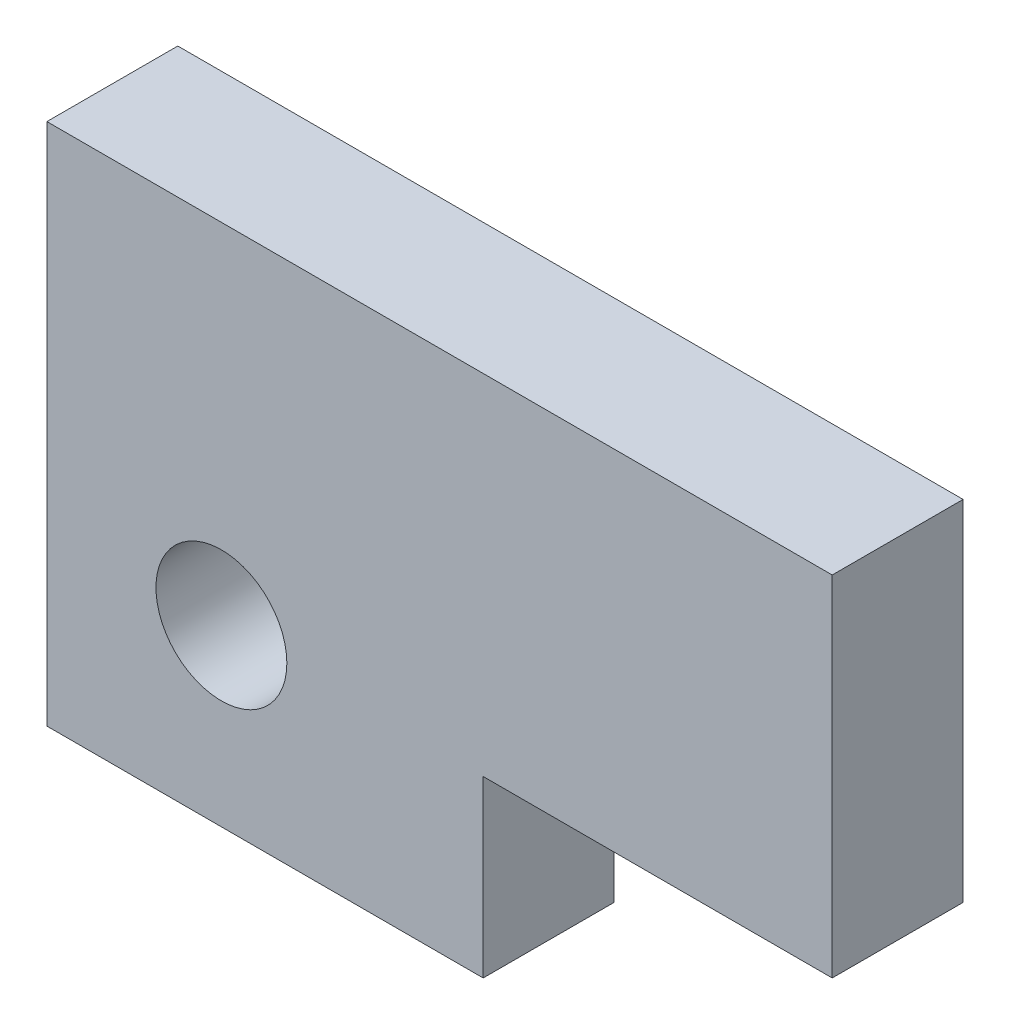
ISO-10303-21;
HEADER;
FILE_DESCRIPTION(('STEP AP214'),'2;1');
FILE_NAME('part.step','',(''),(''),'','','');
FILE_SCHEMA(('AUTOMOTIVE_DESIGN { 1 0 10303 214 1 1 1 1 }'));
ENDSEC;
DATA;
#1=APPLICATION_CONTEXT('core data for automotive mechanical design processes');
#2=APPLICATION_PROTOCOL_DEFINITION('international standard','automotive_design',2000,#1);
#3=PRODUCT_CONTEXT('',#1,'mechanical');
#4=PRODUCT('Part','Part','',(#3));
#5=PRODUCT_RELATED_PRODUCT_CATEGORY('part','',(#4));
#6=PRODUCT_DEFINITION_FORMATION('','',#4);
#7=PRODUCT_DEFINITION_CONTEXT('part definition',#1,'design');
#8=PRODUCT_DEFINITION('design','',#6,#7);
#9=PRODUCT_DEFINITION_SHAPE('','',#8);
#10=(LENGTH_UNIT() NAMED_UNIT(*) SI_UNIT(.MILLI.,.METRE.));
#11=(NAMED_UNIT(*) PLANE_ANGLE_UNIT() SI_UNIT($,.RADIAN.));
#12=(NAMED_UNIT(*) SI_UNIT($,.STERADIAN.) SOLID_ANGLE_UNIT());
#13=UNCERTAINTY_MEASURE_WITH_UNIT(LENGTH_MEASURE(1.E-05),#10,'distance_accuracy_value','');
#14=(GEOMETRIC_REPRESENTATION_CONTEXT(3) GLOBAL_UNCERTAINTY_ASSIGNED_CONTEXT((#13)) GLOBAL_UNIT_ASSIGNED_CONTEXT((#10,
#11,#12)) REPRESENTATION_CONTEXT('',''));
#15=CARTESIAN_POINT('',(0.,0.,0.));
#16=DIRECTION('',(0.,0.,1.));
#17=DIRECTION('',(1.,0.,0.));
#18=AXIS2_PLACEMENT_3D('',#15,#16,#17);
#19=CARTESIAN_POINT('',(0.,0.,3.));
#20=DIRECTION('',(1.,0.,0.));
#21=DIRECTION('',(0.,1.,0.));
#22=AXIS2_PLACEMENT_3D('',#19,#20,#21);
#23=PLANE('',#22);
#24=DIRECTION('',(0.,-1.,0.));
#25=VECTOR('',#24,1.);
#26=CARTESIAN_POINT('',(0.,0.,0.));
#27=LINE('',#26,#25);
#28=CARTESIAN_POINT('',(0.,12.,0.));
#29=VERTEX_POINT('',#28);
#30=CARTESIAN_POINT('',(0.,0.,0.));
#31=VERTEX_POINT('',#30);
#32=EDGE_CURVE('E119',#29,#31,#27,.T.);
#33=ORIENTED_EDGE('',*,*,#32,.T.);
#34=DIRECTION('',(0.,0.,-1.));
#35=VECTOR('',#34,1.);
#36=CARTESIAN_POINT('',(0.,0.,3.));
#37=LINE('',#36,#35);
#38=CARTESIAN_POINT('',(0.,0.,3.));
#39=VERTEX_POINT('',#38);
#40=EDGE_CURVE('E11',#39,#31,#37,.T.);
#41=ORIENTED_EDGE('',*,*,#40,.F.);
#42=DIRECTION('',(0.,-1.,0.));
#43=VECTOR('',#42,1.);
#44=CARTESIAN_POINT('',(0.,0.,3.));
#45=LINE('',#44,#43);
#46=CARTESIAN_POINT('',(0.,12.,3.));
#47=VERTEX_POINT('',#46);
#48=EDGE_CURVE('E130',#47,#39,#45,.T.);
#49=ORIENTED_EDGE('',*,*,#48,.F.);
#50=DIRECTION('',(0.,0.,-1.));
#51=VECTOR('',#50,1.);
#52=CARTESIAN_POINT('',(0.,12.,3.));
#53=LINE('',#52,#51);
#54=EDGE_CURVE('E115',#47,#29,#53,.T.);
#55=ORIENTED_EDGE('',*,*,#54,.T.);
#56=EDGE_LOOP('',(#33,#41,#49,#55));
#57=FACE_BOUND('',#56,.T.);
#58=ADVANCED_FACE('F35',(#57),#23,.F.);
#59=CARTESIAN_POINT('',(0.,0.,3.));
#60=DIRECTION('',(0.,1.,0.));
#61=DIRECTION('',(0.,0.,1.));
#62=AXIS2_PLACEMENT_3D('',#59,#60,#61);
#63=PLANE('',#62);
#64=DIRECTION('',(1.,0.,0.));
#65=VECTOR('',#64,1.);
#66=CARTESIAN_POINT('',(0.,0.,0.));
#67=LINE('',#66,#65);
#68=CARTESIAN_POINT('',(9.99999999999999,0.,0.));
#69=VERTEX_POINT('',#68);
#70=EDGE_CURVE('E122',#31,#69,#67,.T.);
#71=ORIENTED_EDGE('',*,*,#70,.T.);
#72=DIRECTION('',(0.,0.,-1.));
#73=VECTOR('',#72,1.);
#74=CARTESIAN_POINT('',(9.99999999999999,0.,3.));
#75=LINE('',#74,#73);
#76=CARTESIAN_POINT('',(9.99999999999999,0.,3.));
#77=VERTEX_POINT('',#76);
#78=EDGE_CURVE('E43',#77,#69,#75,.T.);
#79=ORIENTED_EDGE('',*,*,#78,.F.);
#80=DIRECTION('',(1.,0.,0.));
#81=VECTOR('',#80,1.);
#82=CARTESIAN_POINT('',(0.,0.,3.));
#83=LINE('',#82,#81);
#84=EDGE_CURVE('E88',#39,#77,#83,.T.);
#85=ORIENTED_EDGE('',*,*,#84,.F.);
#86=ORIENTED_EDGE('',*,*,#40,.T.);
#87=EDGE_LOOP('',(#71,#79,#85,#86));
#88=FACE_BOUND('',#87,.T.);
#89=ADVANCED_FACE('F155',(#88),#63,.F.);
#90=CARTESIAN_POINT('',(9.99999999999999,4.,3.));
#91=DIRECTION('',(-1.,0.,0.));
#92=DIRECTION('',(0.,0.,1.));
#93=AXIS2_PLACEMENT_3D('',#90,#91,#92);
#94=PLANE('',#93);
#95=DIRECTION('',(0.,1.,0.));
#96=VECTOR('',#95,1.);
#97=CARTESIAN_POINT('',(9.99999999999999,4.,0.));
#98=LINE('',#97,#96);
#99=CARTESIAN_POINT('',(9.99999999999999,4.,0.));
#100=VERTEX_POINT('',#99);
#101=EDGE_CURVE('E125',#69,#100,#98,.T.);
#102=ORIENTED_EDGE('',*,*,#101,.T.);
#103=DIRECTION('',(0.,0.,-1.));
#104=VECTOR('',#103,1.);
#105=CARTESIAN_POINT('',(9.99999999999999,4.,3.));
#106=LINE('',#105,#104);
#107=CARTESIAN_POINT('',(9.99999999999999,4.,3.));
#108=VERTEX_POINT('',#107);
#109=EDGE_CURVE('E110',#108,#100,#106,.T.);
#110=ORIENTED_EDGE('',*,*,#109,.F.);
#111=DIRECTION('',(0.,1.,0.));
#112=VECTOR('',#111,1.);
#113=CARTESIAN_POINT('',(9.99999999999999,4.,3.));
#114=LINE('',#113,#112);
#115=EDGE_CURVE('E101',#77,#108,#114,.T.);
#116=ORIENTED_EDGE('',*,*,#115,.F.);
#117=ORIENTED_EDGE('',*,*,#78,.T.);
#118=EDGE_LOOP('',(#102,#110,#116,#117));
#119=FACE_BOUND('',#118,.T.);
#120=ADVANCED_FACE('F136',(#119),#94,.F.);
#121=CARTESIAN_POINT('',(18.,4.,3.));
#122=DIRECTION('',(0.,1.,0.));
#123=DIRECTION('',(-1.,0.,0.));
#124=AXIS2_PLACEMENT_3D('',#121,#122,#123);
#125=PLANE('',#124);
#126=DIRECTION('',(1.,0.,0.));
#127=VECTOR('',#126,1.);
#128=CARTESIAN_POINT('',(18.,4.,0.));
#129=LINE('',#128,#127);
#130=CARTESIAN_POINT('',(18.,4.,0.));
#131=VERTEX_POINT('',#130);
#132=EDGE_CURVE('E109',#100,#131,#129,.T.);
#133=ORIENTED_EDGE('',*,*,#132,.T.);
#134=DIRECTION('',(0.,0.,-1.));
#135=VECTOR('',#134,1.);
#136=CARTESIAN_POINT('',(18.,4.,3.));
#137=LINE('',#136,#135);
#138=CARTESIAN_POINT('',(18.,4.,3.));
#139=VERTEX_POINT('',#138);
#140=EDGE_CURVE('E106',#139,#131,#137,.T.);
#141=ORIENTED_EDGE('',*,*,#140,.F.);
#142=DIRECTION('',(1.,0.,0.));
#143=VECTOR('',#142,1.);
#144=CARTESIAN_POINT('',(18.,4.,3.));
#145=LINE('',#144,#143);
#146=EDGE_CURVE('E95',#108,#139,#145,.T.);
#147=ORIENTED_EDGE('',*,*,#146,.F.);
#148=ORIENTED_EDGE('',*,*,#109,.T.);
#149=EDGE_LOOP('',(#133,#141,#147,#148));
#150=FACE_BOUND('',#149,.T.);
#151=ADVANCED_FACE('F107',(#150),#125,.F.);
#152=CARTESIAN_POINT('',(18.,4.,3.));
#153=DIRECTION('',(-1.,0.,0.));
#154=DIRECTION('',(0.,0.,1.));
#155=AXIS2_PLACEMENT_3D('',#152,#153,#154);
#156=PLANE('',#155);
#157=DIRECTION('',(0.,1.,0.));
#158=VECTOR('',#157,1.);
#159=CARTESIAN_POINT('',(18.,4.,0.));
#160=LINE('',#159,#158);
#161=CARTESIAN_POINT('',(18.,12.,0.));
#162=VERTEX_POINT('',#161);
#163=EDGE_CURVE('E74',#131,#162,#160,.T.);
#164=ORIENTED_EDGE('',*,*,#163,.T.);
#165=DIRECTION('',(0.,0.,-1.));
#166=VECTOR('',#165,1.);
#167=CARTESIAN_POINT('',(18.,12.,3.));
#168=LINE('',#167,#166);
#169=CARTESIAN_POINT('',(18.,12.,3.));
#170=VERTEX_POINT('',#169);
#171=EDGE_CURVE('E111',#170,#162,#168,.T.);
#172=ORIENTED_EDGE('',*,*,#171,.F.);
#173=DIRECTION('',(0.,1.,0.));
#174=VECTOR('',#173,1.);
#175=CARTESIAN_POINT('',(18.,4.,3.));
#176=LINE('',#175,#174);
#177=EDGE_CURVE('E99',#139,#170,#176,.T.);
#178=ORIENTED_EDGE('',*,*,#177,.F.);
#179=ORIENTED_EDGE('',*,*,#140,.T.);
#180=EDGE_LOOP('',(#164,#172,#178,#179));
#181=FACE_BOUND('',#180,.T.);
#182=ADVANCED_FACE('F113',(#181),#156,.F.);
#183=CARTESIAN_POINT('',(0.,12.,3.));
#184=DIRECTION('',(0.,-1.,0.));
#185=DIRECTION('',(1.,0.,0.));
#186=AXIS2_PLACEMENT_3D('',#183,#184,#185);
#187=PLANE('',#186);
#188=DIRECTION('',(-1.,0.,0.));
#189=VECTOR('',#188,1.);
#190=CARTESIAN_POINT('',(0.,12.,0.));
#191=LINE('',#190,#189);
#192=EDGE_CURVE('E80',#162,#29,#191,.T.);
#193=ORIENTED_EDGE('',*,*,#192,.T.);
#194=ORIENTED_EDGE('',*,*,#54,.F.);
#195=DIRECTION('',(-1.,0.,0.));
#196=VECTOR('',#195,1.);
#197=CARTESIAN_POINT('',(0.,12.,3.));
#198=LINE('',#197,#196);
#199=EDGE_CURVE('E51',#170,#47,#198,.T.);
#200=ORIENTED_EDGE('',*,*,#199,.F.);
#201=ORIENTED_EDGE('',*,*,#171,.T.);
#202=EDGE_LOOP('',(#193,#194,#200,#201));
#203=FACE_BOUND('',#202,.T.);
#204=ADVANCED_FACE('F143',(#203),#187,.F.);
#205=CARTESIAN_POINT('',(0.,0.,3.));
#206=DIRECTION('',(0.,0.,-1.));
#207=DIRECTION('',(-1.,0.,0.));
#208=AXIS2_PLACEMENT_3D('',#205,#206,#207);
#209=PLANE('',#208);
#210=CARTESIAN_POINT('',(4.,4.,3.));
#211=DIRECTION('',(0.,0.,1.));
#212=DIRECTION('',(1.,0.,0.));
#213=AXIS2_PLACEMENT_3D('',#210,#211,#212);
#214=CIRCLE('',#213,1.5);
#215=CARTESIAN_POINT('',(5.5,4.,3.));
#216=VERTEX_POINT('',#215);
#217=EDGE_CURVE('E210',#216,#216,#214,.T.);
#218=ORIENTED_EDGE('',*,*,#217,.F.);
#219=EDGE_LOOP('',(#218));
#220=FACE_BOUND('',#219,.T.);
#221=ORIENTED_EDGE('',*,*,#48,.T.);
#222=ORIENTED_EDGE('',*,*,#84,.T.);
#223=ORIENTED_EDGE('',*,*,#115,.T.);
#224=ORIENTED_EDGE('',*,*,#146,.T.);
#225=ORIENTED_EDGE('',*,*,#177,.T.);
#226=ORIENTED_EDGE('',*,*,#199,.T.);
#227=EDGE_LOOP('',(#221,#222,#223,#224,#225,#226));
#228=FACE_BOUND('',#227,.T.);
#229=ADVANCED_FACE('F97',(#220,#228),#209,.F.);
#230=CARTESIAN_POINT('',(0.,0.,0.));
#231=DIRECTION('',(0.,0.,-1.));
#232=DIRECTION('',(-1.,0.,0.));
#233=AXIS2_PLACEMENT_3D('',#230,#231,#232);
#234=PLANE('',#233);
#235=CARTESIAN_POINT('',(4.,4.,0.));
#236=DIRECTION('',(0.,0.,1.));
#237=DIRECTION('',(1.,0.,0.));
#238=AXIS2_PLACEMENT_3D('',#235,#236,#237);
#239=CIRCLE('',#238,1.5);
#240=CARTESIAN_POINT('',(5.5,4.,0.));
#241=VERTEX_POINT('',#240);
#242=EDGE_CURVE('E123',#241,#241,#239,.T.);
#243=ORIENTED_EDGE('',*,*,#242,.T.);
#244=EDGE_LOOP('',(#243));
#245=FACE_BOUND('',#244,.T.);
#246=ORIENTED_EDGE('',*,*,#32,.F.);
#247=ORIENTED_EDGE('',*,*,#192,.F.);
#248=ORIENTED_EDGE('',*,*,#163,.F.);
#249=ORIENTED_EDGE('',*,*,#132,.F.);
#250=ORIENTED_EDGE('',*,*,#101,.F.);
#251=ORIENTED_EDGE('',*,*,#70,.F.);
#252=EDGE_LOOP('',(#246,#247,#248,#249,#250,#251));
#253=FACE_BOUND('',#252,.T.);
#254=ADVANCED_FACE('F139',(#245,#253),#234,.T.);
#255=CARTESIAN_POINT('',(4.,4.,0.));
#256=DIRECTION('',(0.,0.,1.));
#257=DIRECTION('',(1.,0.,0.));
#258=AXIS2_PLACEMENT_3D('',#255,#256,#257);
#259=CYLINDRICAL_SURFACE('',#258,1.5);
#260=ORIENTED_EDGE('',*,*,#242,.F.);
#261=EDGE_LOOP('',(#260));
#262=FACE_BOUND('',#261,.T.);
#263=ORIENTED_EDGE('',*,*,#217,.T.);
#264=EDGE_LOOP('',(#263));
#265=FACE_BOUND('',#264,.T.);
#266=ADVANCED_FACE('F192',(#262,#265),#259,.F.);
#267=CLOSED_SHELL('',(#58,#89,#120,#151,#182,#204,#229,#254,#266));
#268=MANIFOLD_SOLID_BREP('B2',#267);
#269=ADVANCED_BREP_SHAPE_REPRESENTATION('',(#18,#268),#14);
#270=SHAPE_DEFINITION_REPRESENTATION(#9,#269);
ENDSEC;
END-ISO-10303-21;
